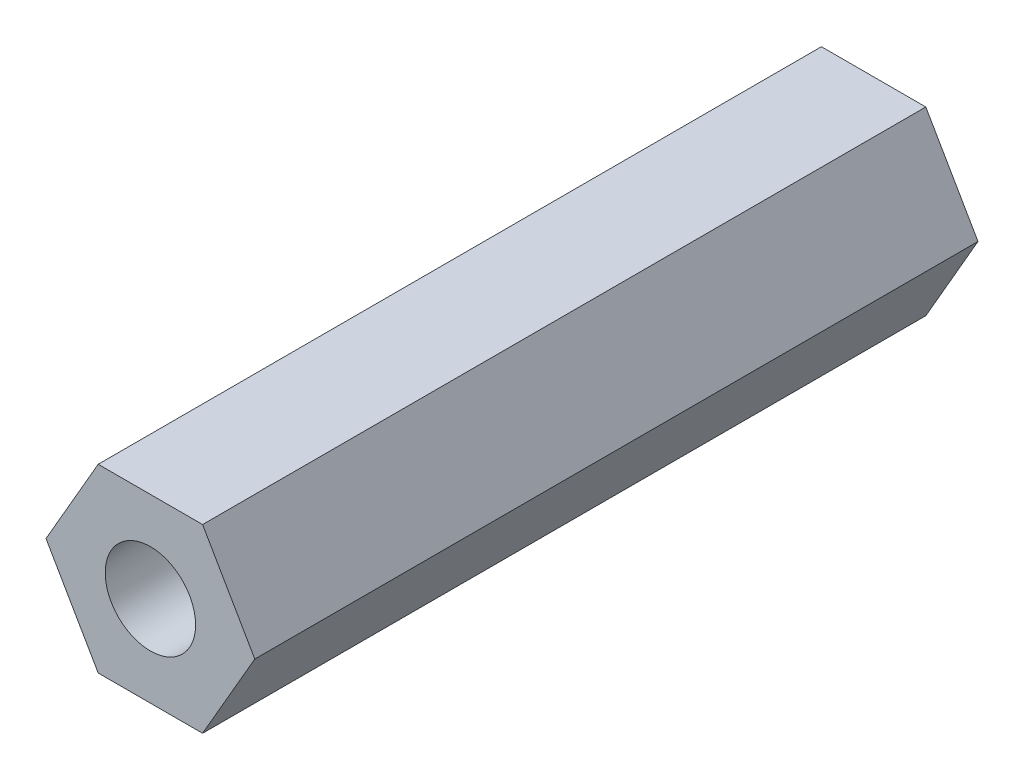
ISO-10303-21;
HEADER;
FILE_DESCRIPTION(('STEP AP214'),'2;1');
FILE_NAME('part.step','',(''),(''),'','','');
FILE_SCHEMA(('AUTOMOTIVE_DESIGN { 1 0 10303 214 1 1 1 1 }'));
ENDSEC;
DATA;
#1=APPLICATION_CONTEXT('core data for automotive mechanical design processes');
#2=APPLICATION_PROTOCOL_DEFINITION('international standard','automotive_design',2000,#1);
#3=PRODUCT_CONTEXT('',#1,'mechanical');
#4=PRODUCT('Part','Part','',(#3));
#5=PRODUCT_RELATED_PRODUCT_CATEGORY('part','',(#4));
#6=PRODUCT_DEFINITION_FORMATION('','',#4);
#7=PRODUCT_DEFINITION_CONTEXT('part definition',#1,'design');
#8=PRODUCT_DEFINITION('design','',#6,#7);
#9=PRODUCT_DEFINITION_SHAPE('','',#8);
#10=(LENGTH_UNIT() NAMED_UNIT(*) SI_UNIT(.MILLI.,.METRE.));
#11=(NAMED_UNIT(*) PLANE_ANGLE_UNIT() SI_UNIT($,.RADIAN.));
#12=(NAMED_UNIT(*) SI_UNIT($,.STERADIAN.) SOLID_ANGLE_UNIT());
#13=UNCERTAINTY_MEASURE_WITH_UNIT(LENGTH_MEASURE(1.E-05),#10,'distance_accuracy_value','');
#14=(GEOMETRIC_REPRESENTATION_CONTEXT(3) GLOBAL_UNCERTAINTY_ASSIGNED_CONTEXT((#13)) GLOBAL_UNIT_ASSIGNED_CONTEXT((#10,
#11,#12)) REPRESENTATION_CONTEXT('',''));
#15=CARTESIAN_POINT('',(0.,0.,0.));
#16=DIRECTION('',(0.,0.,1.));
#17=DIRECTION('',(1.,0.,0.));
#18=AXIS2_PLACEMENT_3D('',#15,#16,#17);
#19=CARTESIAN_POINT('',(0.,0.,50.8));
#20=DIRECTION('',(0.,0.,1.));
#21=DIRECTION('',(1.,0.,0.));
#22=AXIS2_PLACEMENT_3D('',#19,#20,#21);
#23=PLANE('',#22);
#24=DIRECTION('',(-0.5,0.866025403784439,0.));
#25=VECTOR('',#24,1.);
#26=CARTESIAN_POINT('',(7.33234841870825,0.,50.8));
#27=LINE('',#26,#25);
#28=CARTESIAN_POINT('',(7.33234841870825,0.,50.8));
#29=VERTEX_POINT('',#28);
#30=CARTESIAN_POINT('',(3.66617420935413,6.35,50.8));
#31=VERTEX_POINT('',#30);
#32=EDGE_CURVE('E146',#29,#31,#27,.T.);
#33=ORIENTED_EDGE('',*,*,#32,.T.);
#34=DIRECTION('',(-1.,0.,0.));
#35=VECTOR('',#34,1.);
#36=CARTESIAN_POINT('',(3.66617420935413,6.35,50.8));
#37=LINE('',#36,#35);
#38=CARTESIAN_POINT('',(-3.66617420935412,6.35,50.8));
#39=VERTEX_POINT('',#38);
#40=EDGE_CURVE('E94',#31,#39,#37,.T.);
#41=ORIENTED_EDGE('',*,*,#40,.T.);
#42=DIRECTION('',(-0.5,-0.866025403784438,0.));
#43=VECTOR('',#42,1.);
#44=CARTESIAN_POINT('',(-3.66617420935412,6.35,50.8));
#45=LINE('',#44,#43);
#46=CARTESIAN_POINT('',(-7.33234841870825,0.,50.8));
#47=VERTEX_POINT('',#46);
#48=EDGE_CURVE('E107',#39,#47,#45,.T.);
#49=ORIENTED_EDGE('',*,*,#48,.T.);
#50=DIRECTION('',(0.5,-0.866025403784439,0.));
#51=VECTOR('',#50,1.);
#52=CARTESIAN_POINT('',(-7.33234841870825,0.,50.8));
#53=LINE('',#52,#51);
#54=CARTESIAN_POINT('',(-3.66617420935413,-6.35,50.8));
#55=VERTEX_POINT('',#54);
#56=EDGE_CURVE('E101',#47,#55,#53,.T.);
#57=ORIENTED_EDGE('',*,*,#56,.T.);
#58=DIRECTION('',(1.,0.,0.));
#59=VECTOR('',#58,1.);
#60=CARTESIAN_POINT('',(-3.66617420935413,-6.35,50.8));
#61=LINE('',#60,#59);
#62=CARTESIAN_POINT('',(3.66617420935412,-6.35,50.8));
#63=VERTEX_POINT('',#62);
#64=EDGE_CURVE('E105',#55,#63,#61,.T.);
#65=ORIENTED_EDGE('',*,*,#64,.T.);
#66=DIRECTION('',(0.5,0.866025403784438,0.));
#67=VECTOR('',#66,1.);
#68=CARTESIAN_POINT('',(3.66617420935412,-6.35,50.8));
#69=LINE('',#68,#67);
#70=EDGE_CURVE('E57',#63,#29,#69,.T.);
#71=ORIENTED_EDGE('',*,*,#70,.T.);
#72=EDGE_LOOP('',(#33,#41,#49,#57,#65,#71));
#73=FACE_BOUND('',#72,.T.);
#74=CARTESIAN_POINT('',(0.,0.,50.8));
#75=DIRECTION('',(0.,0.,1.));
#76=DIRECTION('',(1.,0.,0.));
#77=AXIS2_PLACEMENT_3D('',#74,#75,#76);
#78=CIRCLE('',#77,3.175);
#79=CARTESIAN_POINT('',(3.175,0.,50.8));
#80=VERTEX_POINT('',#79);
#81=EDGE_CURVE('E134',#80,#80,#78,.T.);
#82=ORIENTED_EDGE('',*,*,#81,.F.);
#83=EDGE_LOOP('',(#82));
#84=FACE_BOUND('',#83,.T.);
#85=ADVANCED_FACE('F39',(#73,#84),#23,.T.);
#86=CARTESIAN_POINT('',(0.,0.,0.));
#87=DIRECTION('',(0.,0.,1.));
#88=DIRECTION('',(1.,0.,0.));
#89=AXIS2_PLACEMENT_3D('',#86,#87,#88);
#90=PLANE('',#89);
#91=DIRECTION('',(-0.5,0.866025403784439,0.));
#92=VECTOR('',#91,1.);
#93=CARTESIAN_POINT('',(7.33234841870825,0.,0.));
#94=LINE('',#93,#92);
#95=CARTESIAN_POINT('',(7.33234841870825,0.,0.));
#96=VERTEX_POINT('',#95);
#97=CARTESIAN_POINT('',(3.66617420935413,6.35,0.));
#98=VERTEX_POINT('',#97);
#99=EDGE_CURVE('E129',#96,#98,#94,.T.);
#100=ORIENTED_EDGE('',*,*,#99,.F.);
#101=DIRECTION('',(0.5,0.866025403784438,0.));
#102=VECTOR('',#101,1.);
#103=CARTESIAN_POINT('',(3.66617420935412,-6.35,0.));
#104=LINE('',#103,#102);
#105=CARTESIAN_POINT('',(3.66617420935412,-6.35,0.));
#106=VERTEX_POINT('',#105);
#107=EDGE_CURVE('E86',#106,#96,#104,.T.);
#108=ORIENTED_EDGE('',*,*,#107,.F.);
#109=DIRECTION('',(1.,0.,0.));
#110=VECTOR('',#109,1.);
#111=CARTESIAN_POINT('',(-3.66617420935413,-6.35,0.));
#112=LINE('',#111,#110);
#113=CARTESIAN_POINT('',(-3.66617420935413,-6.35,0.));
#114=VERTEX_POINT('',#113);
#115=EDGE_CURVE('E80',#114,#106,#112,.T.);
#116=ORIENTED_EDGE('',*,*,#115,.F.);
#117=DIRECTION('',(0.5,-0.866025403784439,0.));
#118=VECTOR('',#117,1.);
#119=CARTESIAN_POINT('',(-7.33234841870825,0.,0.));
#120=LINE('',#119,#118);
#121=CARTESIAN_POINT('',(-7.33234841870825,0.,0.));
#122=VERTEX_POINT('',#121);
#123=EDGE_CURVE('E116',#122,#114,#120,.T.);
#124=ORIENTED_EDGE('',*,*,#123,.F.);
#125=DIRECTION('',(-0.5,-0.866025403784438,0.));
#126=VECTOR('',#125,1.);
#127=CARTESIAN_POINT('',(-3.66617420935412,6.35,0.));
#128=LINE('',#127,#126);
#129=CARTESIAN_POINT('',(-3.66617420935412,6.35,0.));
#130=VERTEX_POINT('',#129);
#131=EDGE_CURVE('E137',#130,#122,#128,.T.);
#132=ORIENTED_EDGE('',*,*,#131,.F.);
#133=DIRECTION('',(-1.,0.,0.));
#134=VECTOR('',#133,1.);
#135=CARTESIAN_POINT('',(3.66617420935413,6.35,0.));
#136=LINE('',#135,#134);
#137=EDGE_CURVE('E133',#98,#130,#136,.T.);
#138=ORIENTED_EDGE('',*,*,#137,.F.);
#139=EDGE_LOOP('',(#100,#108,#116,#124,#132,#138));
#140=FACE_BOUND('',#139,.T.);
#141=CARTESIAN_POINT('',(0.,0.,0.));
#142=DIRECTION('',(0.,0.,1.));
#143=DIRECTION('',(1.,0.,0.));
#144=AXIS2_PLACEMENT_3D('',#141,#142,#143);
#145=CIRCLE('',#144,3.175);
#146=CARTESIAN_POINT('',(3.175,0.,0.));
#147=VERTEX_POINT('',#146);
#148=EDGE_CURVE('E243',#147,#147,#145,.T.);
#149=ORIENTED_EDGE('',*,*,#148,.T.);
#150=EDGE_LOOP('',(#149));
#151=FACE_BOUND('',#150,.T.);
#152=ADVANCED_FACE('F159',(#140,#151),#90,.F.);
#153=CARTESIAN_POINT('',(7.33234841870825,0.,50.8));
#154=DIRECTION('',(-0.866025403784439,-0.5,0.));
#155=DIRECTION('',(0.5,-0.866025403784439,0.));
#156=AXIS2_PLACEMENT_3D('',#153,#154,#155);
#157=PLANE('',#156);
#158=ORIENTED_EDGE('',*,*,#99,.T.);
#159=DIRECTION('',(0.,0.,-1.));
#160=VECTOR('',#159,1.);
#161=CARTESIAN_POINT('',(3.66617420935413,6.35,50.8));
#162=LINE('',#161,#160);
#163=EDGE_CURVE('E11',#31,#98,#162,.T.);
#164=ORIENTED_EDGE('',*,*,#163,.F.);
#165=ORIENTED_EDGE('',*,*,#32,.F.);
#166=DIRECTION('',(0.,0.,-1.));
#167=VECTOR('',#166,1.);
#168=CARTESIAN_POINT('',(7.33234841870825,0.,50.8));
#169=LINE('',#168,#167);
#170=EDGE_CURVE('E125',#29,#96,#169,.T.);
#171=ORIENTED_EDGE('',*,*,#170,.T.);
#172=EDGE_LOOP('',(#158,#164,#165,#171));
#173=FACE_BOUND('',#172,.T.);
#174=ADVANCED_FACE('F41',(#173),#157,.F.);
#175=CARTESIAN_POINT('',(3.66617420935413,6.35,50.8));
#176=DIRECTION('',(0.,-1.,0.));
#177=DIRECTION('',(1.,0.,0.));
#178=AXIS2_PLACEMENT_3D('',#175,#176,#177);
#179=PLANE('',#178);
#180=ORIENTED_EDGE('',*,*,#137,.T.);
#181=DIRECTION('',(0.,0.,-1.));
#182=VECTOR('',#181,1.);
#183=CARTESIAN_POINT('',(-3.66617420935412,6.35,50.8));
#184=LINE('',#183,#182);
#185=EDGE_CURVE('E49',#39,#130,#184,.T.);
#186=ORIENTED_EDGE('',*,*,#185,.F.);
#187=ORIENTED_EDGE('',*,*,#40,.F.);
#188=ORIENTED_EDGE('',*,*,#163,.T.);
#189=EDGE_LOOP('',(#180,#186,#187,#188));
#190=FACE_BOUND('',#189,.T.);
#191=ADVANCED_FACE('F184',(#190),#179,.F.);
#192=CARTESIAN_POINT('',(-3.66617420935412,6.35,50.8));
#193=DIRECTION('',(0.866025403784438,-0.5,0.));
#194=DIRECTION('',(0.5,0.866025403784439,0.));
#195=AXIS2_PLACEMENT_3D('',#192,#193,#194);
#196=PLANE('',#195);
#197=ORIENTED_EDGE('',*,*,#131,.T.);
#198=DIRECTION('',(0.,0.,-1.));
#199=VECTOR('',#198,1.);
#200=CARTESIAN_POINT('',(-7.33234841870825,0.,50.8));
#201=LINE('',#200,#199);
#202=EDGE_CURVE('E118',#47,#122,#201,.T.);
#203=ORIENTED_EDGE('',*,*,#202,.F.);
#204=ORIENTED_EDGE('',*,*,#48,.F.);
#205=ORIENTED_EDGE('',*,*,#185,.T.);
#206=EDGE_LOOP('',(#197,#203,#204,#205));
#207=FACE_BOUND('',#206,.T.);
#208=ADVANCED_FACE('F156',(#207),#196,.F.);
#209=CARTESIAN_POINT('',(-7.33234841870825,0.,50.8));
#210=DIRECTION('',(0.866025403784439,0.5,0.));
#211=DIRECTION('',(-0.5,0.866025403784439,0.));
#212=AXIS2_PLACEMENT_3D('',#209,#210,#211);
#213=PLANE('',#212);
#214=ORIENTED_EDGE('',*,*,#123,.T.);
#215=DIRECTION('',(0.,0.,-1.));
#216=VECTOR('',#215,1.);
#217=CARTESIAN_POINT('',(-3.66617420935413,-6.35,50.8));
#218=LINE('',#217,#216);
#219=EDGE_CURVE('E113',#55,#114,#218,.T.);
#220=ORIENTED_EDGE('',*,*,#219,.F.);
#221=ORIENTED_EDGE('',*,*,#56,.F.);
#222=ORIENTED_EDGE('',*,*,#202,.T.);
#223=EDGE_LOOP('',(#214,#220,#221,#222));
#224=FACE_BOUND('',#223,.T.);
#225=ADVANCED_FACE('F114',(#224),#213,.F.);
#226=CARTESIAN_POINT('',(-3.66617420935413,-6.35,50.8));
#227=DIRECTION('',(0.,1.,0.));
#228=DIRECTION('',(-1.,0.,0.));
#229=AXIS2_PLACEMENT_3D('',#226,#227,#228);
#230=PLANE('',#229);
#231=ORIENTED_EDGE('',*,*,#115,.T.);
#232=DIRECTION('',(0.,0.,-1.));
#233=VECTOR('',#232,1.);
#234=CARTESIAN_POINT('',(3.66617420935412,-6.35,50.8));
#235=LINE('',#234,#233);
#236=EDGE_CURVE('E119',#63,#106,#235,.T.);
#237=ORIENTED_EDGE('',*,*,#236,.F.);
#238=ORIENTED_EDGE('',*,*,#64,.F.);
#239=ORIENTED_EDGE('',*,*,#219,.T.);
#240=EDGE_LOOP('',(#231,#237,#238,#239));
#241=FACE_BOUND('',#240,.T.);
#242=ADVANCED_FACE('F121',(#241),#230,.F.);
#243=CARTESIAN_POINT('',(3.66617420935412,-6.35,50.8));
#244=DIRECTION('',(-0.866025403784438,0.5,0.));
#245=DIRECTION('',(-0.5,-0.866025403784438,0.));
#246=AXIS2_PLACEMENT_3D('',#243,#244,#245);
#247=PLANE('',#246);
#248=ORIENTED_EDGE('',*,*,#107,.T.);
#249=ORIENTED_EDGE('',*,*,#170,.F.);
#250=ORIENTED_EDGE('',*,*,#70,.F.);
#251=ORIENTED_EDGE('',*,*,#236,.T.);
#252=EDGE_LOOP('',(#248,#249,#250,#251));
#253=FACE_BOUND('',#252,.T.);
#254=ADVANCED_FACE('F164',(#253),#247,.F.);
#255=CARTESIAN_POINT('',(0.,0.,50.8));
#256=DIRECTION('',(0.,0.,-1.));
#257=DIRECTION('',(-1.,0.,0.));
#258=AXIS2_PLACEMENT_3D('',#255,#256,#257);
#259=CYLINDRICAL_SURFACE('',#258,3.175);
#260=ORIENTED_EDGE('',*,*,#81,.T.);
#261=EDGE_LOOP('',(#260));
#262=FACE_BOUND('',#261,.T.);
#263=ORIENTED_EDGE('',*,*,#148,.F.);
#264=EDGE_LOOP('',(#263));
#265=FACE_BOUND('',#264,.T.);
#266=ADVANCED_FACE('F166',(#262,#265),#259,.F.);
#267=CLOSED_SHELL('',(#85,#152,#174,#191,#208,#225,#242,#254,#266));
#268=MANIFOLD_SOLID_BREP('B2',#267);
#269=ADVANCED_BREP_SHAPE_REPRESENTATION('',(#18,#268),#14);
#270=SHAPE_DEFINITION_REPRESENTATION(#9,#269);
ENDSEC;
END-ISO-10303-21;
